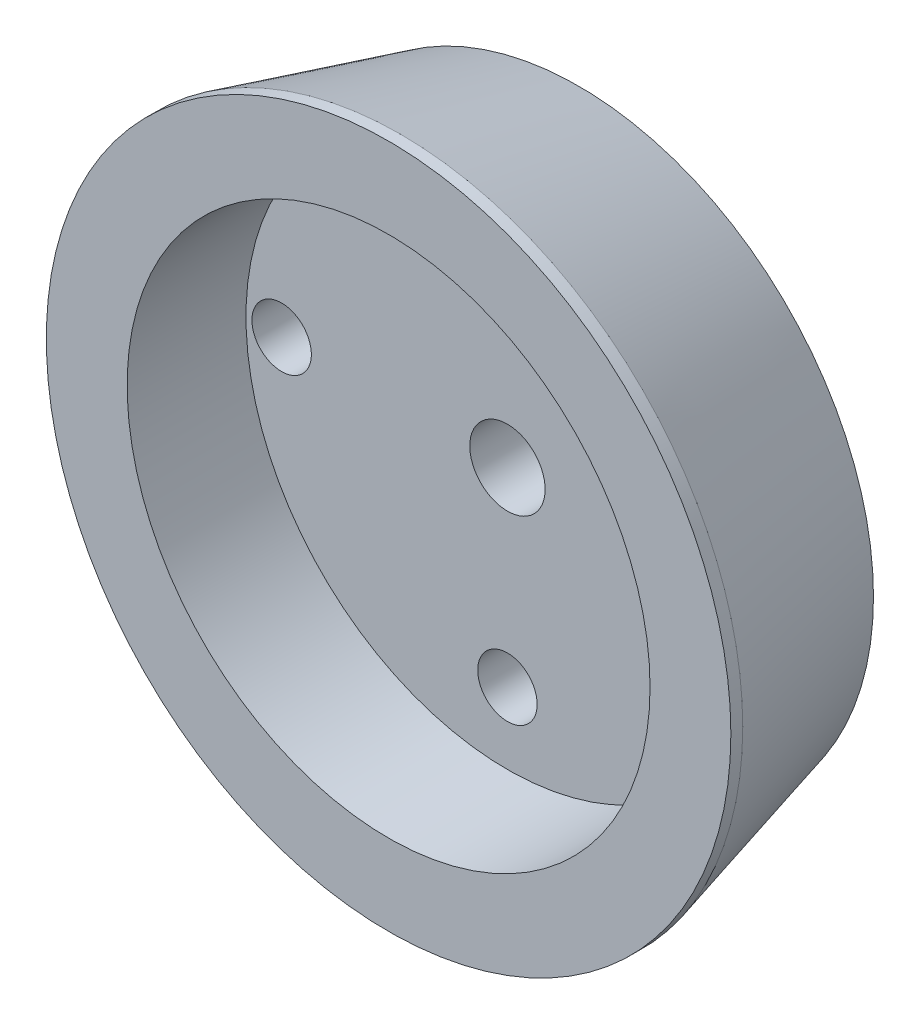
ISO-10303-21;
HEADER;
FILE_DESCRIPTION(('STEP AP214'),'2;1');
FILE_NAME('part.step','',(''),(''),'','','');
FILE_SCHEMA(('AUTOMOTIVE_DESIGN { 1 0 10303 214 1 1 1 1 }'));
ENDSEC;
DATA;
#1=APPLICATION_CONTEXT('core data for automotive mechanical design processes');
#2=APPLICATION_PROTOCOL_DEFINITION('international standard','automotive_design',2000,#1);
#3=PRODUCT_CONTEXT('',#1,'mechanical');
#4=PRODUCT('Part','Part','',(#3));
#5=PRODUCT_RELATED_PRODUCT_CATEGORY('part','',(#4));
#6=PRODUCT_DEFINITION_FORMATION('','',#4);
#7=PRODUCT_DEFINITION_CONTEXT('part definition',#1,'design');
#8=PRODUCT_DEFINITION('design','',#6,#7);
#9=PRODUCT_DEFINITION_SHAPE('','',#8);
#10=(LENGTH_UNIT() NAMED_UNIT(*) SI_UNIT(.MILLI.,.METRE.));
#11=(NAMED_UNIT(*) PLANE_ANGLE_UNIT() SI_UNIT($,.RADIAN.));
#12=(NAMED_UNIT(*) SI_UNIT($,.STERADIAN.) SOLID_ANGLE_UNIT());
#13=UNCERTAINTY_MEASURE_WITH_UNIT(LENGTH_MEASURE(1.E-05),#10,'distance_accuracy_value','');
#14=(GEOMETRIC_REPRESENTATION_CONTEXT(3) GLOBAL_UNCERTAINTY_ASSIGNED_CONTEXT((#13)) GLOBAL_UNIT_ASSIGNED_CONTEXT((#10,
#11,#12)) REPRESENTATION_CONTEXT('',''));
#15=CARTESIAN_POINT('',(0.,0.,0.));
#16=DIRECTION('',(0.,0.,1.));
#17=DIRECTION('',(1.,0.,0.));
#18=AXIS2_PLACEMENT_3D('',#15,#16,#17);
#19=CARTESIAN_POINT('',(-300.000000000001,667.332012286223,-390.857743681072));
#20=DIRECTION('',(0.,0.,-1.));
#21=DIRECTION('',(-1.,0.,0.));
#22=AXIS2_PLACEMENT_3D('',#19,#20,#21);
#23=PLANE('',#22);
#24=CARTESIAN_POINT('',(-300.000000000001,667.332012286223,-390.857743681072));
#25=DIRECTION('',(0.,0.,1.));
#26=DIRECTION('',(1.,0.,0.));
#27=AXIS2_PLACEMENT_3D('',#24,#25,#26);
#28=CIRCLE('',#27,11.);
#29=CARTESIAN_POINT('',(-289.000000000001,667.332012286223,-390.857743681072));
#30=VERTEX_POINT('',#29);
#31=EDGE_CURVE('E18',#30,#30,#28,.F.);
#32=ORIENTED_EDGE('',*,*,#31,.T.);
#33=EDGE_LOOP('',(#32));
#34=FACE_BOUND('',#33,.T.);
#35=CARTESIAN_POINT('',(-300.000000000001,667.332012286223,-390.857743681072));
#36=DIRECTION('',(0.,0.,1.));
#37=DIRECTION('',(1.,0.,0.));
#38=AXIS2_PLACEMENT_3D('',#35,#36,#37);
#39=CIRCLE('',#38,14.4);
#40=CARTESIAN_POINT('',(-285.600000000001,667.332012286223,-390.857743681072));
#41=VERTEX_POINT('',#40);
#42=EDGE_CURVE('E60',#41,#41,#39,.F.);
#43=ORIENTED_EDGE('',*,*,#42,.F.);
#44=EDGE_LOOP('',(#43));
#45=FACE_BOUND('',#44,.T.);
#46=ADVANCED_FACE('F15',(#34,#45),#23,.F.);
#47=CARTESIAN_POINT('',(-300.000000000001,667.332012286223,-385.357743681072));
#48=DIRECTION('',(0.,0.,1.));
#49=DIRECTION('',(1.,0.,0.));
#50=AXIS2_PLACEMENT_3D('',#47,#48,#49);
#51=CYLINDRICAL_SURFACE('',#50,11.);
#52=ORIENTED_EDGE('',*,*,#31,.F.);
#53=EDGE_LOOP('',(#52));
#54=FACE_BOUND('',#53,.T.);
#55=CARTESIAN_POINT('',(-300.000000000001,667.332012286223,-395.857743681072));
#56=DIRECTION('',(0.,0.,1.));
#57=DIRECTION('',(1.,0.,0.));
#58=AXIS2_PLACEMENT_3D('',#55,#56,#57);
#59=CIRCLE('',#58,11.);
#60=CARTESIAN_POINT('',(-289.000000000001,667.332012286223,-395.857743681072));
#61=VERTEX_POINT('',#60);
#62=EDGE_CURVE('E58',#61,#61,#59,.F.);
#63=ORIENTED_EDGE('',*,*,#62,.T.);
#64=EDGE_LOOP('',(#63));
#65=FACE_BOUND('',#64,.T.);
#66=ADVANCED_FACE('F69',(#54,#65),#51,.F.);
#67=CARTESIAN_POINT('',(-300.000000000001,667.332012286223,-394.857743681072));
#68=DIRECTION('',(0.,0.,1.));
#69=DIRECTION('',(1.,0.,0.));
#70=AXIS2_PLACEMENT_3D('',#67,#68,#69);
#71=CYLINDRICAL_SURFACE('',#70,14.4);
#72=ORIENTED_EDGE('',*,*,#42,.T.);
#73=EDGE_LOOP('',(#72));
#74=FACE_BOUND('',#73,.T.);
#75=CARTESIAN_POINT('',(-300.000000000001,667.332012286223,-391.357743680774));
#76=DIRECTION('',(0.,0.,1.));
#77=DIRECTION('',(0.,1.,0.));
#78=AXIS2_PLACEMENT_3D('',#75,#76,#77);
#79=CIRCLE('',#78,14.3999999988833);
#80=CARTESIAN_POINT('',(-300.000000000001,681.732012285106,-391.357743680774));
#81=VERTEX_POINT('',#80);
#82=EDGE_CURVE('E30',#81,#81,#79,.F.);
#83=ORIENTED_EDGE('',*,*,#82,.F.);
#84=EDGE_LOOP('',(#83));
#85=FACE_BOUND('',#84,.T.);
#86=ADVANCED_FACE('F72',(#74,#85),#71,.T.);
#87=CARTESIAN_POINT('',(-300.000000000001,667.332012286223,-395.857743681072));
#88=DIRECTION('',(0.,0.,-1.));
#89=DIRECTION('',(-1.,0.,0.));
#90=AXIS2_PLACEMENT_3D('',#87,#88,#89);
#91=PLANE('',#90);
#92=CARTESIAN_POINT('',(-290.5,667.332012286223,-395.857743681072));
#93=DIRECTION('',(0.,0.,-1.));
#94=DIRECTION('',(-1.,0.,0.));
#95=AXIS2_PLACEMENT_3D('',#92,#93,#94);
#96=CIRCLE('',#95,1.25);
#97=CARTESIAN_POINT('',(-291.75,667.332012286223,-395.857743681072));
#98=VERTEX_POINT('',#97);
#99=EDGE_CURVE('E55',#98,#98,#96,.T.);
#100=ORIENTED_EDGE('',*,*,#99,.T.);
#101=EDGE_LOOP('',(#100));
#102=FACE_BOUND('',#101,.T.);
#103=CARTESIAN_POINT('',(-309.5,667.332012286223,-395.857743681072));
#104=DIRECTION('',(0.,0.,-1.));
#105=DIRECTION('',(-1.,0.,0.));
#106=AXIS2_PLACEMENT_3D('',#103,#104,#105);
#107=CIRCLE('',#106,1.25);
#108=CARTESIAN_POINT('',(-310.75,667.332012286223,-395.857743681072));
#109=VERTEX_POINT('',#108);
#110=EDGE_CURVE('E52',#109,#109,#107,.T.);
#111=ORIENTED_EDGE('',*,*,#110,.T.);
#112=EDGE_LOOP('',(#111));
#113=FACE_BOUND('',#112,.T.);
#114=CARTESIAN_POINT('',(-300.000000000001,667.332012286223,-395.857743681072));
#115=DIRECTION('',(0.,0.,-1.));
#116=DIRECTION('',(0.,1.,0.));
#117=AXIS2_PLACEMENT_3D('',#114,#115,#116);
#118=CIRCLE('',#117,1.585);
#119=CARTESIAN_POINT('',(-300.000000000001,668.917012286223,-395.857743681072));
#120=VERTEX_POINT('',#119);
#121=EDGE_CURVE('E49',#120,#120,#118,.T.);
#122=ORIENTED_EDGE('',*,*,#121,.T.);
#123=EDGE_LOOP('',(#122));
#124=FACE_BOUND('',#123,.T.);
#125=CARTESIAN_POINT('',(-300.000000000001,675.332012286224,-395.857743681072));
#126=DIRECTION('',(0.,0.,1.));
#127=DIRECTION('',(1.,0.,0.));
#128=AXIS2_PLACEMENT_3D('',#125,#126,#127);
#129=CIRCLE('',#128,1.25);
#130=CARTESIAN_POINT('',(-298.750000000001,675.332012286224,-395.857743681072));
#131=VERTEX_POINT('',#130);
#132=EDGE_CURVE('E46',#131,#131,#129,.F.);
#133=ORIENTED_EDGE('',*,*,#132,.T.);
#134=EDGE_LOOP('',(#133));
#135=FACE_BOUND('',#134,.T.);
#136=CARTESIAN_POINT('',(-300.000000000001,659.332012286223,-395.857743681072));
#137=DIRECTION('',(0.,0.,1.));
#138=DIRECTION('',(1.,0.,0.));
#139=AXIS2_PLACEMENT_3D('',#136,#137,#138);
#140=CIRCLE('',#139,1.25);
#141=CARTESIAN_POINT('',(-298.750000000001,659.332012286223,-395.857743681072));
#142=VERTEX_POINT('',#141);
#143=EDGE_CURVE('E43',#142,#142,#140,.F.);
#144=ORIENTED_EDGE('',*,*,#143,.T.);
#145=EDGE_LOOP('',(#144));
#146=FACE_BOUND('',#145,.T.);
#147=ORIENTED_EDGE('',*,*,#62,.F.);
#148=EDGE_LOOP('',(#147));
#149=FACE_BOUND('',#148,.T.);
#150=ADVANCED_FACE('F75',(#102,#113,#124,#135,#146,#149),#91,.F.);
#151=CARTESIAN_POINT('',(-300.000000000001,667.332012286223,-391.357743680774));
#152=DIRECTION('',(0.,0.,1.));
#153=DIRECTION('',(1.,0.,0.));
#154=AXIS2_PLACEMENT_3D('',#151,#152,#153);
#155=CONICAL_SURFACE('',#154,14.3999999988833,0.260602391449563);
#156=CARTESIAN_POINT('',(-300.000000000001,667.332012286223,-398.85774368137));
#157=DIRECTION('',(0.,0.,1.));
#158=DIRECTION('',(1.,0.,0.));
#159=AXIS2_PLACEMENT_3D('',#156,#157,#158);
#160=CIRCLE('',#159,12.4000000011166);
#161=CARTESIAN_POINT('',(-287.599999998884,667.332012286223,-398.85774368137));
#162=VERTEX_POINT('',#161);
#163=EDGE_CURVE('E40',#162,#162,#160,.F.);
#164=ORIENTED_EDGE('',*,*,#163,.F.);
#165=EDGE_LOOP('',(#164));
#166=FACE_BOUND('',#165,.T.);
#167=ORIENTED_EDGE('',*,*,#82,.T.);
#168=EDGE_LOOP('',(#167));
#169=FACE_BOUND('',#168,.T.);
#170=ADVANCED_FACE('F77',(#166,#169),#155,.T.);
#171=CARTESIAN_POINT('',(-290.5,667.332012286223,-401.531320838952));
#172=DIRECTION('',(0.,0.,-1.));
#173=DIRECTION('',(-1.,0.,0.));
#174=AXIS2_PLACEMENT_3D('',#171,#172,#173);
#175=CYLINDRICAL_SURFACE('',#174,1.25);
#176=ORIENTED_EDGE('',*,*,#99,.F.);
#177=EDGE_LOOP('',(#176));
#178=FACE_BOUND('',#177,.T.);
#179=CARTESIAN_POINT('',(-290.5,667.332012286223,-398.857743681072));
#180=DIRECTION('',(0.,0.,-1.));
#181=DIRECTION('',(-1.,0.,0.));
#182=AXIS2_PLACEMENT_3D('',#179,#180,#181);
#183=CIRCLE('',#182,1.25);
#184=CARTESIAN_POINT('',(-291.75,667.332012286223,-398.857743681072));
#185=VERTEX_POINT('',#184);
#186=EDGE_CURVE('E37',#185,#185,#183,.F.);
#187=ORIENTED_EDGE('',*,*,#186,.F.);
#188=EDGE_LOOP('',(#187));
#189=FACE_BOUND('',#188,.T.);
#190=ADVANCED_FACE('F85',(#178,#189),#175,.F.);
#191=CARTESIAN_POINT('',(-309.5,667.332012286223,-401.531320838952));
#192=DIRECTION('',(0.,0.,-1.));
#193=DIRECTION('',(-1.,0.,0.));
#194=AXIS2_PLACEMENT_3D('',#191,#192,#193);
#195=CYLINDRICAL_SURFACE('',#194,1.25);
#196=ORIENTED_EDGE('',*,*,#110,.F.);
#197=EDGE_LOOP('',(#196));
#198=FACE_BOUND('',#197,.T.);
#199=CARTESIAN_POINT('',(-309.5,667.332012286223,-398.857743681072));
#200=DIRECTION('',(0.,0.,-1.));
#201=DIRECTION('',(-1.,0.,0.));
#202=AXIS2_PLACEMENT_3D('',#199,#200,#201);
#203=CIRCLE('',#202,1.25);
#204=CARTESIAN_POINT('',(-310.75,667.332012286223,-398.857743681072));
#205=VERTEX_POINT('',#204);
#206=EDGE_CURVE('E34',#205,#205,#203,.F.);
#207=ORIENTED_EDGE('',*,*,#206,.F.);
#208=EDGE_LOOP('',(#207));
#209=FACE_BOUND('',#208,.T.);
#210=ADVANCED_FACE('F108',(#198,#209),#195,.F.);
#211=CARTESIAN_POINT('',(-300.000000000001,667.332012286223,-388.959800531473));
#212=DIRECTION('',(0.,0.,-1.));
#213=DIRECTION('',(0.,1.,0.));
#214=AXIS2_PLACEMENT_3D('',#211,#212,#213);
#215=CYLINDRICAL_SURFACE('',#214,1.585);
#216=ORIENTED_EDGE('',*,*,#121,.F.);
#217=EDGE_LOOP('',(#216));
#218=FACE_BOUND('',#217,.T.);
#219=CARTESIAN_POINT('',(-300.000000000001,667.332012286223,-398.857743681072));
#220=DIRECTION('',(0.,0.,-1.));
#221=DIRECTION('',(0.,1.,0.));
#222=AXIS2_PLACEMENT_3D('',#219,#220,#221);
#223=CIRCLE('',#222,1.585);
#224=CARTESIAN_POINT('',(-300.000000000001,668.917012286223,-398.857743681072));
#225=VERTEX_POINT('',#224);
#226=EDGE_CURVE('E27',#225,#225,#223,.F.);
#227=ORIENTED_EDGE('',*,*,#226,.F.);
#228=EDGE_LOOP('',(#227));
#229=FACE_BOUND('',#228,.T.);
#230=ADVANCED_FACE('F104',(#218,#229),#215,.F.);
#231=CARTESIAN_POINT('',(-300.000000000001,675.332012286224,-397.357743681072));
#232=DIRECTION('',(0.,0.,1.));
#233=DIRECTION('',(1.,0.,0.));
#234=AXIS2_PLACEMENT_3D('',#231,#232,#233);
#235=CYLINDRICAL_SURFACE('',#234,1.25);
#236=CARTESIAN_POINT('',(-300.000000000001,675.332012286224,-398.857743681072));
#237=DIRECTION('',(0.,0.,1.));
#238=DIRECTION('',(1.,0.,0.));
#239=AXIS2_PLACEMENT_3D('',#236,#237,#238);
#240=CIRCLE('',#239,1.25);
#241=CARTESIAN_POINT('',(-298.750000000001,675.332012286224,-398.857743681072));
#242=VERTEX_POINT('',#241);
#243=EDGE_CURVE('E22',#242,#242,#240,.T.);
#244=ORIENTED_EDGE('',*,*,#243,.F.);
#245=EDGE_LOOP('',(#244));
#246=FACE_BOUND('',#245,.T.);
#247=ORIENTED_EDGE('',*,*,#132,.F.);
#248=EDGE_LOOP('',(#247));
#249=FACE_BOUND('',#248,.T.);
#250=ADVANCED_FACE('F97',(#246,#249),#235,.F.);
#251=CARTESIAN_POINT('',(-300.000000000001,659.332012286223,-397.357743681072));
#252=DIRECTION('',(0.,0.,1.));
#253=DIRECTION('',(1.,0.,0.));
#254=AXIS2_PLACEMENT_3D('',#251,#252,#253);
#255=CYLINDRICAL_SURFACE('',#254,1.25);
#256=CARTESIAN_POINT('',(-300.000000000001,659.332012286223,-398.857743681072));
#257=DIRECTION('',(0.,0.,1.));
#258=DIRECTION('',(1.,0.,0.));
#259=AXIS2_PLACEMENT_3D('',#256,#257,#258);
#260=CIRCLE('',#259,1.25);
#261=CARTESIAN_POINT('',(-298.750000000001,659.332012286223,-398.857743681072));
#262=VERTEX_POINT('',#261);
#263=EDGE_CURVE('E10',#262,#262,#260,.T.);
#264=ORIENTED_EDGE('',*,*,#263,.F.);
#265=EDGE_LOOP('',(#264));
#266=FACE_BOUND('',#265,.T.);
#267=ORIENTED_EDGE('',*,*,#143,.F.);
#268=EDGE_LOOP('',(#267));
#269=FACE_BOUND('',#268,.T.);
#270=ADVANCED_FACE('F92',(#266,#269),#255,.F.);
#271=CARTESIAN_POINT('',(-300.000000000001,667.332012286223,-398.857743681072));
#272=DIRECTION('',(0.,0.,-1.));
#273=DIRECTION('',(-1.,0.,0.));
#274=AXIS2_PLACEMENT_3D('',#271,#272,#273);
#275=PLANE('',#274);
#276=ORIENTED_EDGE('',*,*,#263,.T.);
#277=EDGE_LOOP('',(#276));
#278=FACE_BOUND('',#277,.T.);
#279=ORIENTED_EDGE('',*,*,#243,.T.);
#280=EDGE_LOOP('',(#279));
#281=FACE_BOUND('',#280,.T.);
#282=ORIENTED_EDGE('',*,*,#226,.T.);
#283=EDGE_LOOP('',(#282));
#284=FACE_BOUND('',#283,.T.);
#285=ORIENTED_EDGE('',*,*,#206,.T.);
#286=EDGE_LOOP('',(#285));
#287=FACE_BOUND('',#286,.T.);
#288=ORIENTED_EDGE('',*,*,#186,.T.);
#289=EDGE_LOOP('',(#288));
#290=FACE_BOUND('',#289,.T.);
#291=ORIENTED_EDGE('',*,*,#163,.T.);
#292=EDGE_LOOP('',(#291));
#293=FACE_BOUND('',#292,.T.);
#294=ADVANCED_FACE('F90',(#278,#281,#284,#287,#290,#293),#275,.T.);
#295=CLOSED_SHELL('',(#46,#66,#86,#150,#170,#190,#210,#230,#250,#270,#294));
#296=MANIFOLD_SOLID_BREP('B1',#295);
#297=ADVANCED_BREP_SHAPE_REPRESENTATION('',(#18,#296),#14);
#298=SHAPE_DEFINITION_REPRESENTATION(#9,#297);
ENDSEC;
END-ISO-10303-21;
